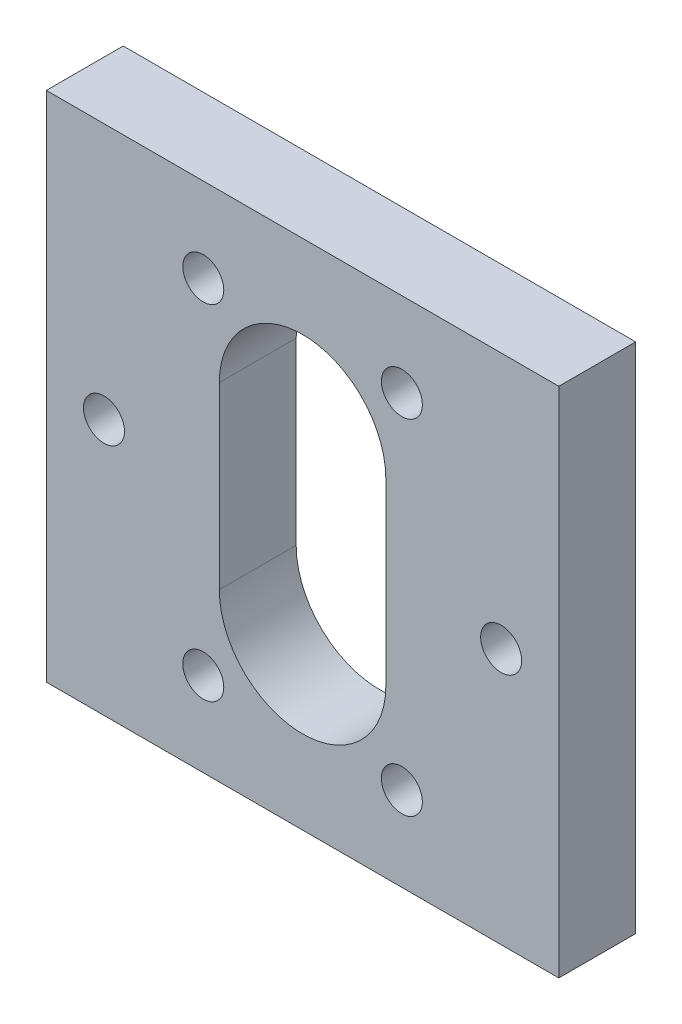
ISO-10303-21;
HEADER;
FILE_DESCRIPTION(('STEP AP214'),'2;1');
FILE_NAME('part.step','',(''),(''),'','','');
FILE_SCHEMA(('AUTOMOTIVE_DESIGN { 1 0 10303 214 1 1 1 1 }'));
ENDSEC;
DATA;
#1=APPLICATION_CONTEXT('core data for automotive mechanical design processes');
#2=APPLICATION_PROTOCOL_DEFINITION('international standard','automotive_design',2000,#1);
#3=PRODUCT_CONTEXT('',#1,'mechanical');
#4=PRODUCT('Part','Part','',(#3));
#5=PRODUCT_RELATED_PRODUCT_CATEGORY('part','',(#4));
#6=PRODUCT_DEFINITION_FORMATION('','',#4);
#7=PRODUCT_DEFINITION_CONTEXT('part definition',#1,'design');
#8=PRODUCT_DEFINITION('design','',#6,#7);
#9=PRODUCT_DEFINITION_SHAPE('','',#8);
#10=(LENGTH_UNIT() NAMED_UNIT(*) SI_UNIT(.MILLI.,.METRE.));
#11=(NAMED_UNIT(*) PLANE_ANGLE_UNIT() SI_UNIT($,.RADIAN.));
#12=(NAMED_UNIT(*) SI_UNIT($,.STERADIAN.) SOLID_ANGLE_UNIT());
#13=UNCERTAINTY_MEASURE_WITH_UNIT(LENGTH_MEASURE(1.E-05),#10,'distance_accuracy_value','');
#14=(GEOMETRIC_REPRESENTATION_CONTEXT(3) GLOBAL_UNCERTAINTY_ASSIGNED_CONTEXT((#13)) GLOBAL_UNIT_ASSIGNED_CONTEXT((#10,
#11,#12)) REPRESENTATION_CONTEXT('',''));
#15=CARTESIAN_POINT('',(0.,0.,0.));
#16=DIRECTION('',(0.,0.,1.));
#17=DIRECTION('',(1.,0.,0.));
#18=AXIS2_PLACEMENT_3D('',#15,#16,#17);
#19=CARTESIAN_POINT('',(20.,-20.,6.));
#20=DIRECTION('',(-1.,0.,0.));
#21=DIRECTION('',(0.,0.,1.));
#22=AXIS2_PLACEMENT_3D('',#19,#20,#21);
#23=PLANE('',#22);
#24=DIRECTION('',(0.,1.,0.));
#25=VECTOR('',#24,1.);
#26=CARTESIAN_POINT('',(20.,-20.,0.));
#27=LINE('',#26,#25);
#28=CARTESIAN_POINT('',(20.,-20.,0.));
#29=VERTEX_POINT('',#28);
#30=CARTESIAN_POINT('',(20.,20.,0.));
#31=VERTEX_POINT('',#30);
#32=EDGE_CURVE('E133',#29,#31,#27,.T.);
#33=ORIENTED_EDGE('',*,*,#32,.T.);
#34=DIRECTION('',(0.,0.,-1.));
#35=VECTOR('',#34,1.);
#36=CARTESIAN_POINT('',(20.,20.,6.));
#37=LINE('',#36,#35);
#38=CARTESIAN_POINT('',(20.,20.,6.));
#39=VERTEX_POINT('',#38);
#40=EDGE_CURVE('E11',#39,#31,#37,.T.);
#41=ORIENTED_EDGE('',*,*,#40,.F.);
#42=DIRECTION('',(0.,1.,0.));
#43=VECTOR('',#42,1.);
#44=CARTESIAN_POINT('',(20.,-20.,6.));
#45=LINE('',#44,#43);
#46=CARTESIAN_POINT('',(20.,-20.,6.));
#47=VERTEX_POINT('',#46);
#48=EDGE_CURVE('E138',#47,#39,#45,.T.);
#49=ORIENTED_EDGE('',*,*,#48,.F.);
#50=DIRECTION('',(0.,0.,-1.));
#51=VECTOR('',#50,1.);
#52=CARTESIAN_POINT('',(20.,-20.,6.));
#53=LINE('',#52,#51);
#54=EDGE_CURVE('E125',#47,#29,#53,.T.);
#55=ORIENTED_EDGE('',*,*,#54,.T.);
#56=EDGE_LOOP('',(#33,#41,#49,#55));
#57=FACE_BOUND('',#56,.T.);
#58=ADVANCED_FACE('F32',(#57),#23,.F.);
#59=CARTESIAN_POINT('',(-20.,20.,6.));
#60=DIRECTION('',(0.,-1.,0.));
#61=DIRECTION('',(0.,0.,-1.));
#62=AXIS2_PLACEMENT_3D('',#59,#60,#61);
#63=PLANE('',#62);
#64=DIRECTION('',(-1.,0.,0.));
#65=VECTOR('',#64,1.);
#66=CARTESIAN_POINT('',(-20.,20.,0.));
#67=LINE('',#66,#65);
#68=CARTESIAN_POINT('',(-20.,20.,0.));
#69=VERTEX_POINT('',#68);
#70=EDGE_CURVE('E87',#31,#69,#67,.T.);
#71=ORIENTED_EDGE('',*,*,#70,.T.);
#72=DIRECTION('',(0.,0.,-1.));
#73=VECTOR('',#72,1.);
#74=CARTESIAN_POINT('',(-20.,20.,6.));
#75=LINE('',#74,#73);
#76=CARTESIAN_POINT('',(-20.,20.,6.));
#77=VERTEX_POINT('',#76);
#78=EDGE_CURVE('E40',#77,#69,#75,.T.);
#79=ORIENTED_EDGE('',*,*,#78,.F.);
#80=DIRECTION('',(-1.,0.,0.));
#81=VECTOR('',#80,1.);
#82=CARTESIAN_POINT('',(-20.,20.,6.));
#83=LINE('',#82,#81);
#84=EDGE_CURVE('E110',#39,#77,#83,.T.);
#85=ORIENTED_EDGE('',*,*,#84,.F.);
#86=ORIENTED_EDGE('',*,*,#40,.T.);
#87=EDGE_LOOP('',(#71,#79,#85,#86));
#88=FACE_BOUND('',#87,.T.);
#89=ADVANCED_FACE('F166',(#88),#63,.F.);
#90=CARTESIAN_POINT('',(-20.,-20.,6.));
#91=DIRECTION('',(1.,0.,0.));
#92=DIRECTION('',(0.,0.,-1.));
#93=AXIS2_PLACEMENT_3D('',#90,#91,#92);
#94=PLANE('',#93);
#95=DIRECTION('',(0.,-1.,0.));
#96=VECTOR('',#95,1.);
#97=CARTESIAN_POINT('',(-20.,-20.,0.));
#98=LINE('',#97,#96);
#99=CARTESIAN_POINT('',(-20.,-20.,0.));
#100=VERTEX_POINT('',#99);
#101=EDGE_CURVE('E95',#69,#100,#98,.T.);
#102=ORIENTED_EDGE('',*,*,#101,.T.);
#103=DIRECTION('',(0.,0.,-1.));
#104=VECTOR('',#103,1.);
#105=CARTESIAN_POINT('',(-20.,-20.,6.));
#106=LINE('',#105,#104);
#107=CARTESIAN_POINT('',(-20.,-20.,6.));
#108=VERTEX_POINT('',#107);
#109=EDGE_CURVE('E123',#108,#100,#106,.T.);
#110=ORIENTED_EDGE('',*,*,#109,.F.);
#111=DIRECTION('',(0.,-1.,0.));
#112=VECTOR('',#111,1.);
#113=CARTESIAN_POINT('',(-20.,-20.,6.));
#114=LINE('',#113,#112);
#115=EDGE_CURVE('E118',#77,#108,#114,.T.);
#116=ORIENTED_EDGE('',*,*,#115,.F.);
#117=ORIENTED_EDGE('',*,*,#78,.T.);
#118=EDGE_LOOP('',(#102,#110,#116,#117));
#119=FACE_BOUND('',#118,.T.);
#120=ADVANCED_FACE('F124',(#119),#94,.F.);
#121=CARTESIAN_POINT('',(-20.,-20.,6.));
#122=DIRECTION('',(0.,1.,0.));
#123=DIRECTION('',(0.,0.,1.));
#124=AXIS2_PLACEMENT_3D('',#121,#122,#123);
#125=PLANE('',#124);
#126=DIRECTION('',(1.,0.,0.));
#127=VECTOR('',#126,1.);
#128=CARTESIAN_POINT('',(-20.,-20.,0.));
#129=LINE('',#128,#127);
#130=EDGE_CURVE('E102',#100,#29,#129,.T.);
#131=ORIENTED_EDGE('',*,*,#130,.T.);
#132=ORIENTED_EDGE('',*,*,#54,.F.);
#133=DIRECTION('',(1.,0.,0.));
#134=VECTOR('',#133,1.);
#135=CARTESIAN_POINT('',(-20.,-20.,6.));
#136=LINE('',#135,#134);
#137=EDGE_CURVE('E121',#108,#47,#136,.T.);
#138=ORIENTED_EDGE('',*,*,#137,.F.);
#139=ORIENTED_EDGE('',*,*,#109,.T.);
#140=EDGE_LOOP('',(#131,#132,#138,#139));
#141=FACE_BOUND('',#140,.T.);
#142=ADVANCED_FACE('F127',(#141),#125,.F.);
#143=CARTESIAN_POINT('',(0.,0.,6.));
#144=DIRECTION('',(0.,0.,-1.));
#145=DIRECTION('',(-1.,0.,0.));
#146=AXIS2_PLACEMENT_3D('',#143,#144,#145);
#147=PLANE('',#146);
#148=CARTESIAN_POINT('',(-15.5,0.,6.));
#149=DIRECTION('',(0.,0.,1.));
#150=DIRECTION('',(1.,0.,0.));
#151=AXIS2_PLACEMENT_3D('',#148,#149,#150);
#152=CIRCLE('',#151,1.6);
#153=CARTESIAN_POINT('',(-13.9,0.,6.));
#154=VERTEX_POINT('',#153);
#155=EDGE_CURVE('E337',#154,#154,#152,.T.);
#156=ORIENTED_EDGE('',*,*,#155,.F.);
#157=EDGE_LOOP('',(#156));
#158=FACE_BOUND('',#157,.T.);
#159=CARTESIAN_POINT('',(-7.75000000000016,-13.4233937586587,6.));
#160=DIRECTION('',(0.,0.,1.));
#161=DIRECTION('',(1.,0.,0.));
#162=AXIS2_PLACEMENT_3D('',#159,#160,#161);
#163=CIRCLE('',#162,1.6);
#164=CARTESIAN_POINT('',(-6.15000000000015,-13.4233937586587,6.));
#165=VERTEX_POINT('',#164);
#166=EDGE_CURVE('E338',#165,#165,#163,.T.);
#167=ORIENTED_EDGE('',*,*,#166,.F.);
#168=EDGE_LOOP('',(#167));
#169=FACE_BOUND('',#168,.T.);
#170=CARTESIAN_POINT('',(7.74999999999987,-13.4233937586589,6.));
#171=DIRECTION('',(0.,0.,1.));
#172=DIRECTION('',(1.,0.,0.));
#173=AXIS2_PLACEMENT_3D('',#170,#171,#172);
#174=CIRCLE('',#173,1.6);
#175=CARTESIAN_POINT('',(9.34999999999988,-13.4233937586589,6.));
#176=VERTEX_POINT('',#175);
#177=EDGE_CURVE('E312',#176,#176,#174,.T.);
#178=ORIENTED_EDGE('',*,*,#177,.F.);
#179=EDGE_LOOP('',(#178));
#180=FACE_BOUND('',#179,.T.);
#181=CARTESIAN_POINT('',(15.5,-1.08235921504137E-13,6.));
#182=DIRECTION('',(0.,0.,1.));
#183=DIRECTION('',(1.,0.,0.));
#184=AXIS2_PLACEMENT_3D('',#181,#182,#183);
#185=CIRCLE('',#184,1.6);
#186=CARTESIAN_POINT('',(17.1,-1.08235921504137E-13,6.));
#187=VERTEX_POINT('',#186);
#188=EDGE_CURVE('E319',#187,#187,#185,.T.);
#189=ORIENTED_EDGE('',*,*,#188,.F.);
#190=EDGE_LOOP('',(#189));
#191=FACE_BOUND('',#190,.T.);
#192=CARTESIAN_POINT('',(7.75000000000006,13.4233937586588,6.));
#193=DIRECTION('',(0.,0.,1.));
#194=DIRECTION('',(1.,0.,0.));
#195=AXIS2_PLACEMENT_3D('',#192,#193,#194);
#196=CIRCLE('',#195,1.6);
#197=CARTESIAN_POINT('',(9.35000000000006,13.4233937586588,6.));
#198=VERTEX_POINT('',#197);
#199=EDGE_CURVE('E325',#198,#198,#196,.T.);
#200=ORIENTED_EDGE('',*,*,#199,.F.);
#201=EDGE_LOOP('',(#200));
#202=FACE_BOUND('',#201,.T.);
#203=CARTESIAN_POINT('',(-7.74999999999997,13.4233937586588,6.));
#204=DIRECTION('',(0.,0.,1.));
#205=DIRECTION('',(1.,0.,0.));
#206=AXIS2_PLACEMENT_3D('',#203,#204,#205);
#207=CIRCLE('',#206,1.6);
#208=CARTESIAN_POINT('',(-6.14999999999997,13.4233937586588,6.));
#209=VERTEX_POINT('',#208);
#210=EDGE_CURVE('E331',#209,#209,#207,.T.);
#211=ORIENTED_EDGE('',*,*,#210,.F.);
#212=EDGE_LOOP('',(#211));
#213=FACE_BOUND('',#212,.T.);
#214=DIRECTION('',(0.,1.,0.));
#215=VECTOR('',#214,1.);
#216=CARTESIAN_POINT('',(6.5,-7.,6.));
#217=LINE('',#216,#215);
#218=CARTESIAN_POINT('',(6.5,-7.,6.));
#219=VERTEX_POINT('',#218);
#220=CARTESIAN_POINT('',(6.5,7.,6.));
#221=VERTEX_POINT('',#220);
#222=EDGE_CURVE('E141',#219,#221,#217,.T.);
#223=ORIENTED_EDGE('',*,*,#222,.F.);
#224=CARTESIAN_POINT('',(0.,-7.,6.));
#225=DIRECTION('',(0.,0.,1.));
#226=DIRECTION('',(1.,0.,0.));
#227=AXIS2_PLACEMENT_3D('',#224,#225,#226);
#228=CIRCLE('',#227,6.5);
#229=CARTESIAN_POINT('',(-6.5,-7.,6.));
#230=VERTEX_POINT('',#229);
#231=EDGE_CURVE('E35',#230,#219,#228,.T.);
#232=ORIENTED_EDGE('',*,*,#231,.F.);
#233=DIRECTION('',(0.,-1.,0.));
#234=VECTOR('',#233,1.);
#235=CARTESIAN_POINT('',(-6.5,-7.,6.));
#236=LINE('',#235,#234);
#237=CARTESIAN_POINT('',(-6.5,7.,6.));
#238=VERTEX_POINT('',#237);
#239=EDGE_CURVE('E78',#238,#230,#236,.T.);
#240=ORIENTED_EDGE('',*,*,#239,.F.);
#241=CARTESIAN_POINT('',(0.,7.,6.));
#242=DIRECTION('',(0.,0.,1.));
#243=DIRECTION('',(1.,0.,0.));
#244=AXIS2_PLACEMENT_3D('',#241,#242,#243);
#245=CIRCLE('',#244,6.5);
#246=EDGE_CURVE('E143',#221,#238,#245,.T.);
#247=ORIENTED_EDGE('',*,*,#246,.F.);
#248=EDGE_LOOP('',(#223,#232,#240,#247));
#249=FACE_BOUND('',#248,.T.);
#250=ORIENTED_EDGE('',*,*,#48,.T.);
#251=ORIENTED_EDGE('',*,*,#84,.T.);
#252=ORIENTED_EDGE('',*,*,#115,.T.);
#253=ORIENTED_EDGE('',*,*,#137,.T.);
#254=EDGE_LOOP('',(#250,#251,#252,#253));
#255=FACE_BOUND('',#254,.T.);
#256=ADVANCED_FACE('F119',(#158,#169,#180,#191,#202,#213,#249,#255),#147,.F.);
#257=CARTESIAN_POINT('',(0.,0.,0.));
#258=DIRECTION('',(0.,0.,-1.));
#259=DIRECTION('',(-1.,0.,0.));
#260=AXIS2_PLACEMENT_3D('',#257,#258,#259);
#261=PLANE('',#260);
#262=CARTESIAN_POINT('',(-15.5,0.,0.));
#263=DIRECTION('',(0.,0.,1.));
#264=DIRECTION('',(1.,0.,0.));
#265=AXIS2_PLACEMENT_3D('',#262,#263,#264);
#266=CIRCLE('',#265,1.6);
#267=CARTESIAN_POINT('',(-13.9,0.,0.));
#268=VERTEX_POINT('',#267);
#269=EDGE_CURVE('E306',#268,#268,#266,.T.);
#270=ORIENTED_EDGE('',*,*,#269,.T.);
#271=EDGE_LOOP('',(#270));
#272=FACE_BOUND('',#271,.T.);
#273=CARTESIAN_POINT('',(-7.75000000000016,-13.4233937586587,0.));
#274=DIRECTION('',(0.,0.,1.));
#275=DIRECTION('',(1.,0.,0.));
#276=AXIS2_PLACEMENT_3D('',#273,#274,#275);
#277=CIRCLE('',#276,1.6);
#278=CARTESIAN_POINT('',(-6.15000000000015,-13.4233937586587,0.));
#279=VERTEX_POINT('',#278);
#280=EDGE_CURVE('E316',#279,#279,#277,.T.);
#281=ORIENTED_EDGE('',*,*,#280,.T.);
#282=EDGE_LOOP('',(#281));
#283=FACE_BOUND('',#282,.T.);
#284=CARTESIAN_POINT('',(7.74999999999987,-13.4233937586589,0.));
#285=DIRECTION('',(0.,0.,1.));
#286=DIRECTION('',(1.,0.,0.));
#287=AXIS2_PLACEMENT_3D('',#284,#285,#286);
#288=CIRCLE('',#287,1.6);
#289=CARTESIAN_POINT('',(9.34999999999988,-13.4233937586589,0.));
#290=VERTEX_POINT('',#289);
#291=EDGE_CURVE('E315',#290,#290,#288,.T.);
#292=ORIENTED_EDGE('',*,*,#291,.T.);
#293=EDGE_LOOP('',(#292));
#294=FACE_BOUND('',#293,.T.);
#295=CARTESIAN_POINT('',(15.5,-1.08235921504137E-13,0.));
#296=DIRECTION('',(0.,0.,1.));
#297=DIRECTION('',(1.,0.,0.));
#298=AXIS2_PLACEMENT_3D('',#295,#296,#297);
#299=CIRCLE('',#298,1.6);
#300=CARTESIAN_POINT('',(17.1,-1.08235921504137E-13,0.));
#301=VERTEX_POINT('',#300);
#302=EDGE_CURVE('E322',#301,#301,#299,.T.);
#303=ORIENTED_EDGE('',*,*,#302,.T.);
#304=EDGE_LOOP('',(#303));
#305=FACE_BOUND('',#304,.T.);
#306=CARTESIAN_POINT('',(7.75000000000006,13.4233937586588,0.));
#307=DIRECTION('',(0.,0.,1.));
#308=DIRECTION('',(1.,0.,0.));
#309=AXIS2_PLACEMENT_3D('',#306,#307,#308);
#310=CIRCLE('',#309,1.6);
#311=CARTESIAN_POINT('',(9.35000000000006,13.4233937586588,0.));
#312=VERTEX_POINT('',#311);
#313=EDGE_CURVE('E328',#312,#312,#310,.T.);
#314=ORIENTED_EDGE('',*,*,#313,.T.);
#315=EDGE_LOOP('',(#314));
#316=FACE_BOUND('',#315,.T.);
#317=CARTESIAN_POINT('',(-7.74999999999997,13.4233937586588,0.));
#318=DIRECTION('',(0.,0.,1.));
#319=DIRECTION('',(1.,0.,0.));
#320=AXIS2_PLACEMENT_3D('',#317,#318,#319);
#321=CIRCLE('',#320,1.6);
#322=CARTESIAN_POINT('',(-6.14999999999997,13.4233937586588,0.));
#323=VERTEX_POINT('',#322);
#324=EDGE_CURVE('E334',#323,#323,#321,.T.);
#325=ORIENTED_EDGE('',*,*,#324,.T.);
#326=EDGE_LOOP('',(#325));
#327=FACE_BOUND('',#326,.T.);
#328=CARTESIAN_POINT('',(0.,-7.,0.));
#329=DIRECTION('',(0.,0.,1.));
#330=DIRECTION('',(1.,0.,0.));
#331=AXIS2_PLACEMENT_3D('',#328,#329,#330);
#332=CIRCLE('',#331,6.5);
#333=CARTESIAN_POINT('',(-6.5,-7.,0.));
#334=VERTEX_POINT('',#333);
#335=CARTESIAN_POINT('',(6.5,-7.,0.));
#336=VERTEX_POINT('',#335);
#337=EDGE_CURVE('E303',#334,#336,#332,.T.);
#338=ORIENTED_EDGE('',*,*,#337,.T.);
#339=DIRECTION('',(0.,1.,0.));
#340=VECTOR('',#339,1.);
#341=CARTESIAN_POINT('',(6.5,-7.,0.));
#342=LINE('',#341,#340);
#343=CARTESIAN_POINT('',(6.5,7.,0.));
#344=VERTEX_POINT('',#343);
#345=EDGE_CURVE('E305',#336,#344,#342,.T.);
#346=ORIENTED_EDGE('',*,*,#345,.T.);
#347=CARTESIAN_POINT('',(0.,7.,0.));
#348=DIRECTION('',(0.,0.,1.));
#349=DIRECTION('',(1.,0.,0.));
#350=AXIS2_PLACEMENT_3D('',#347,#348,#349);
#351=CIRCLE('',#350,6.5);
#352=CARTESIAN_POINT('',(-6.5,7.,0.));
#353=VERTEX_POINT('',#352);
#354=EDGE_CURVE('E57',#344,#353,#351,.T.);
#355=ORIENTED_EDGE('',*,*,#354,.T.);
#356=DIRECTION('',(0.,-1.,0.));
#357=VECTOR('',#356,1.);
#358=CARTESIAN_POINT('',(-6.5,-7.,0.));
#359=LINE('',#358,#357);
#360=EDGE_CURVE('E160',#353,#334,#359,.T.);
#361=ORIENTED_EDGE('',*,*,#360,.T.);
#362=EDGE_LOOP('',(#338,#346,#355,#361));
#363=FACE_BOUND('',#362,.T.);
#364=ORIENTED_EDGE('',*,*,#32,.F.);
#365=ORIENTED_EDGE('',*,*,#130,.F.);
#366=ORIENTED_EDGE('',*,*,#101,.F.);
#367=ORIENTED_EDGE('',*,*,#70,.F.);
#368=EDGE_LOOP('',(#364,#365,#366,#367));
#369=FACE_BOUND('',#368,.T.);
#370=ADVANCED_FACE('F167',(#272,#283,#294,#305,#316,#327,#363,#369),#261,.T.);
#371=CARTESIAN_POINT('',(0.,-7.,0.));
#372=DIRECTION('',(0.,0.,1.));
#373=DIRECTION('',(1.,0.,0.));
#374=AXIS2_PLACEMENT_3D('',#371,#372,#373);
#375=CYLINDRICAL_SURFACE('',#374,6.5);
#376=DIRECTION('',(0.,0.,1.));
#377=VECTOR('',#376,1.);
#378=CARTESIAN_POINT('',(6.5,-7.,0.));
#379=LINE('',#378,#377);
#380=EDGE_CURVE('E48',#336,#219,#379,.T.);
#381=ORIENTED_EDGE('',*,*,#380,.F.);
#382=ORIENTED_EDGE('',*,*,#337,.F.);
#383=DIRECTION('',(0.,0.,1.));
#384=VECTOR('',#383,1.);
#385=CARTESIAN_POINT('',(-6.5,-7.,0.));
#386=LINE('',#385,#384);
#387=EDGE_CURVE('E144',#334,#230,#386,.T.);
#388=ORIENTED_EDGE('',*,*,#387,.T.);
#389=ORIENTED_EDGE('',*,*,#231,.T.);
#390=EDGE_LOOP('',(#381,#382,#388,#389));
#391=FACE_BOUND('',#390,.T.);
#392=ADVANCED_FACE('F148',(#391),#375,.F.);
#393=CARTESIAN_POINT('',(-6.5,-7.,0.));
#394=DIRECTION('',(-1.,0.,0.));
#395=DIRECTION('',(0.,-1.,0.));
#396=AXIS2_PLACEMENT_3D('',#393,#394,#395);
#397=PLANE('',#396);
#398=ORIENTED_EDGE('',*,*,#387,.F.);
#399=ORIENTED_EDGE('',*,*,#360,.F.);
#400=DIRECTION('',(0.,0.,1.));
#401=VECTOR('',#400,1.);
#402=CARTESIAN_POINT('',(-6.5,7.,0.));
#403=LINE('',#402,#401);
#404=EDGE_CURVE('E157',#353,#238,#403,.T.);
#405=ORIENTED_EDGE('',*,*,#404,.T.);
#406=ORIENTED_EDGE('',*,*,#239,.T.);
#407=EDGE_LOOP('',(#398,#399,#405,#406));
#408=FACE_BOUND('',#407,.T.);
#409=ADVANCED_FACE('F175',(#408),#397,.F.);
#410=CARTESIAN_POINT('',(0.,7.,0.));
#411=DIRECTION('',(0.,0.,1.));
#412=DIRECTION('',(1.,0.,0.));
#413=AXIS2_PLACEMENT_3D('',#410,#411,#412);
#414=CYLINDRICAL_SURFACE('',#413,6.5);
#415=ORIENTED_EDGE('',*,*,#404,.F.);
#416=ORIENTED_EDGE('',*,*,#354,.F.);
#417=DIRECTION('',(0.,0.,1.));
#418=VECTOR('',#417,1.);
#419=CARTESIAN_POINT('',(6.5,7.,0.));
#420=LINE('',#419,#418);
#421=EDGE_CURVE('E154',#344,#221,#420,.T.);
#422=ORIENTED_EDGE('',*,*,#421,.T.);
#423=ORIENTED_EDGE('',*,*,#246,.T.);
#424=EDGE_LOOP('',(#415,#416,#422,#423));
#425=FACE_BOUND('',#424,.T.);
#426=ADVANCED_FACE('F156',(#425),#414,.F.);
#427=CARTESIAN_POINT('',(6.5,-7.,0.));
#428=DIRECTION('',(1.,0.,0.));
#429=DIRECTION('',(0.,0.,-1.));
#430=AXIS2_PLACEMENT_3D('',#427,#428,#429);
#431=PLANE('',#430);
#432=ORIENTED_EDGE('',*,*,#421,.F.);
#433=ORIENTED_EDGE('',*,*,#345,.F.);
#434=ORIENTED_EDGE('',*,*,#380,.T.);
#435=ORIENTED_EDGE('',*,*,#222,.T.);
#436=EDGE_LOOP('',(#432,#433,#434,#435));
#437=FACE_BOUND('',#436,.T.);
#438=ADVANCED_FACE('F153',(#437),#431,.F.);
#439=CARTESIAN_POINT('',(-7.74999999999997,13.4233937586588,0.));
#440=DIRECTION('',(0.,0.,1.));
#441=DIRECTION('',(1.,0.,0.));
#442=AXIS2_PLACEMENT_3D('',#439,#440,#441);
#443=CYLINDRICAL_SURFACE('',#442,1.6);
#444=ORIENTED_EDGE('',*,*,#324,.F.);
#445=EDGE_LOOP('',(#444));
#446=FACE_BOUND('',#445,.T.);
#447=ORIENTED_EDGE('',*,*,#210,.T.);
#448=EDGE_LOOP('',(#447));
#449=FACE_BOUND('',#448,.T.);
#450=ADVANCED_FACE('F215',(#446,#449),#443,.F.);
#451=CARTESIAN_POINT('',(7.75000000000006,13.4233937586588,0.));
#452=DIRECTION('',(0.,0.,1.));
#453=DIRECTION('',(1.,0.,0.));
#454=AXIS2_PLACEMENT_3D('',#451,#452,#453);
#455=CYLINDRICAL_SURFACE('',#454,1.6);
#456=ORIENTED_EDGE('',*,*,#313,.F.);
#457=EDGE_LOOP('',(#456));
#458=FACE_BOUND('',#457,.T.);
#459=ORIENTED_EDGE('',*,*,#199,.T.);
#460=EDGE_LOOP('',(#459));
#461=FACE_BOUND('',#460,.T.);
#462=ADVANCED_FACE('F220',(#458,#461),#455,.F.);
#463=CARTESIAN_POINT('',(15.5,-1.08235921504137E-13,0.));
#464=DIRECTION('',(0.,0.,1.));
#465=DIRECTION('',(1.,0.,0.));
#466=AXIS2_PLACEMENT_3D('',#463,#464,#465);
#467=CYLINDRICAL_SURFACE('',#466,1.6);
#468=ORIENTED_EDGE('',*,*,#302,.F.);
#469=EDGE_LOOP('',(#468));
#470=FACE_BOUND('',#469,.T.);
#471=ORIENTED_EDGE('',*,*,#188,.T.);
#472=EDGE_LOOP('',(#471));
#473=FACE_BOUND('',#472,.T.);
#474=ADVANCED_FACE('F230',(#470,#473),#467,.F.);
#475=CARTESIAN_POINT('',(7.74999999999987,-13.4233937586589,0.));
#476=DIRECTION('',(0.,0.,1.));
#477=DIRECTION('',(1.,0.,0.));
#478=AXIS2_PLACEMENT_3D('',#475,#476,#477);
#479=CYLINDRICAL_SURFACE('',#478,1.6);
#480=ORIENTED_EDGE('',*,*,#291,.F.);
#481=EDGE_LOOP('',(#480));
#482=FACE_BOUND('',#481,.T.);
#483=ORIENTED_EDGE('',*,*,#177,.T.);
#484=EDGE_LOOP('',(#483));
#485=FACE_BOUND('',#484,.T.);
#486=ADVANCED_FACE('F240',(#482,#485),#479,.F.);
#487=CARTESIAN_POINT('',(-7.75000000000016,-13.4233937586587,0.));
#488=DIRECTION('',(0.,0.,1.));
#489=DIRECTION('',(1.,0.,0.));
#490=AXIS2_PLACEMENT_3D('',#487,#488,#489);
#491=CYLINDRICAL_SURFACE('',#490,1.6);
#492=ORIENTED_EDGE('',*,*,#280,.F.);
#493=EDGE_LOOP('',(#492));
#494=FACE_BOUND('',#493,.T.);
#495=ORIENTED_EDGE('',*,*,#166,.T.);
#496=EDGE_LOOP('',(#495));
#497=FACE_BOUND('',#496,.T.);
#498=ADVANCED_FACE('F250',(#494,#497),#491,.F.);
#499=CARTESIAN_POINT('',(-15.5,0.,0.));
#500=DIRECTION('',(0.,0.,1.));
#501=DIRECTION('',(1.,0.,0.));
#502=AXIS2_PLACEMENT_3D('',#499,#500,#501);
#503=CYLINDRICAL_SURFACE('',#502,1.6);
#504=ORIENTED_EDGE('',*,*,#269,.F.);
#505=EDGE_LOOP('',(#504));
#506=FACE_BOUND('',#505,.T.);
#507=ORIENTED_EDGE('',*,*,#155,.T.);
#508=EDGE_LOOP('',(#507));
#509=FACE_BOUND('',#508,.T.);
#510=ADVANCED_FACE('F260',(#506,#509),#503,.F.);
#511=CLOSED_SHELL('',(#58,#89,#120,#142,#256,#370,#392,#409,#426,#438,#450,#462,#474,#486,#498,#510));
#512=MANIFOLD_SOLID_BREP('B2',#511);
#513=ADVANCED_BREP_SHAPE_REPRESENTATION('',(#18,#512),#14);
#514=SHAPE_DEFINITION_REPRESENTATION(#9,#513);
ENDSEC;
END-ISO-10303-21;
